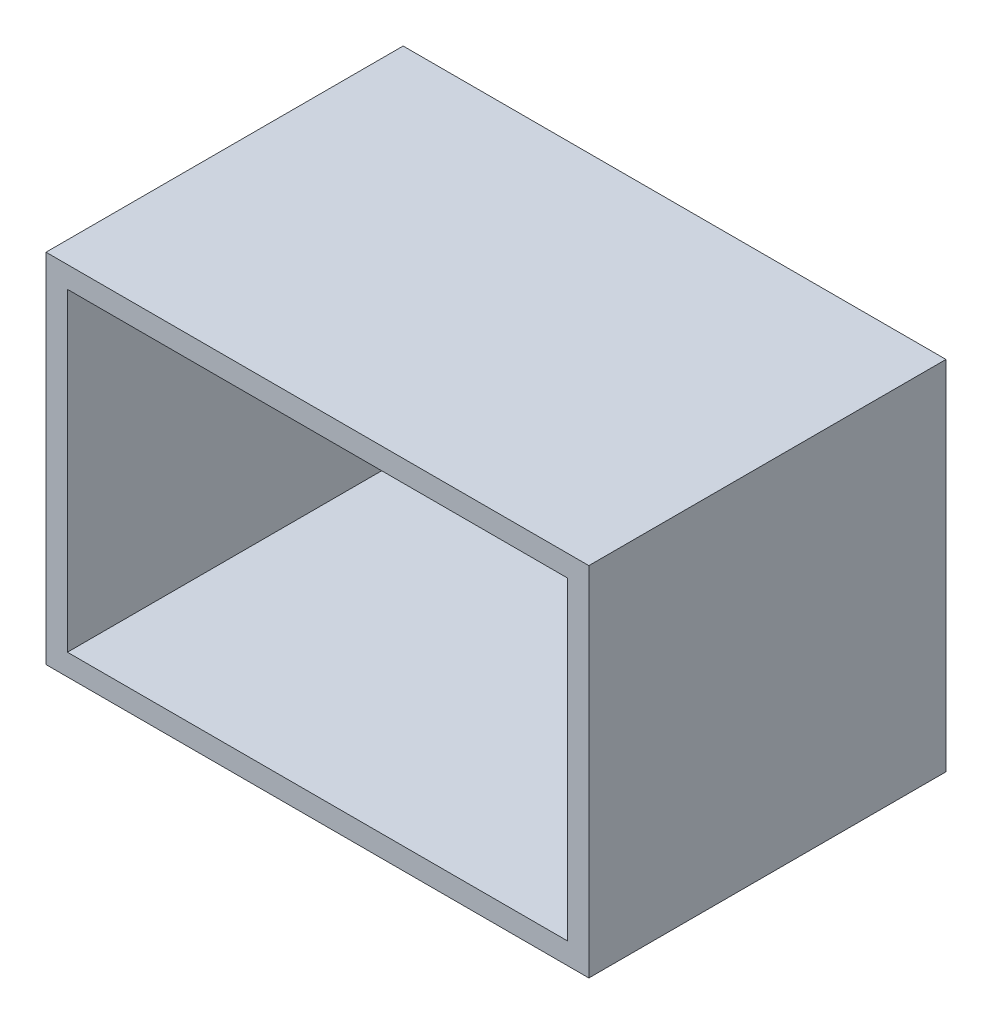
ISO-10303-21;
HEADER;
FILE_DESCRIPTION(('STEP AP214'),'2;1');
FILE_NAME('part.step','',(''),(''),'','','');
FILE_SCHEMA(('AUTOMOTIVE_DESIGN { 1 0 10303 214 1 1 1 1 }'));
ENDSEC;
DATA;
#1=APPLICATION_CONTEXT('core data for automotive mechanical design processes');
#2=APPLICATION_PROTOCOL_DEFINITION('international standard','automotive_design',2000,#1);
#3=PRODUCT_CONTEXT('',#1,'mechanical');
#4=PRODUCT('Part','Part','',(#3));
#5=PRODUCT_RELATED_PRODUCT_CATEGORY('part','',(#4));
#6=PRODUCT_DEFINITION_FORMATION('','',#4);
#7=PRODUCT_DEFINITION_CONTEXT('part definition',#1,'design');
#8=PRODUCT_DEFINITION('design','',#6,#7);
#9=PRODUCT_DEFINITION_SHAPE('','',#8);
#10=(LENGTH_UNIT() NAMED_UNIT(*) SI_UNIT(.MILLI.,.METRE.));
#11=(NAMED_UNIT(*) PLANE_ANGLE_UNIT() SI_UNIT($,.RADIAN.));
#12=(NAMED_UNIT(*) SI_UNIT($,.STERADIAN.) SOLID_ANGLE_UNIT());
#13=UNCERTAINTY_MEASURE_WITH_UNIT(LENGTH_MEASURE(1.E-05),#10,'distance_accuracy_value','');
#14=(GEOMETRIC_REPRESENTATION_CONTEXT(3) GLOBAL_UNCERTAINTY_ASSIGNED_CONTEXT((#13)) GLOBAL_UNIT_ASSIGNED_CONTEXT((#10,
#11,#12)) REPRESENTATION_CONTEXT('',''));
#15=CARTESIAN_POINT('',(0.,0.,0.));
#16=DIRECTION('',(0.,0.,1.));
#17=DIRECTION('',(1.,0.,0.));
#18=AXIS2_PLACEMENT_3D('',#15,#16,#17);
#19=CARTESIAN_POINT('',(0.,0.,50.));
#20=DIRECTION('',(0.,0.,-1.));
#21=DIRECTION('',(-1.,0.,0.));
#22=AXIS2_PLACEMENT_3D('',#19,#20,#21);
#23=PLANE('',#22);
#24=DIRECTION('',(0.,1.,0.));
#25=VECTOR('',#24,1.);
#26=CARTESIAN_POINT('',(38.,-25.,50.));
#27=LINE('',#26,#25);
#28=CARTESIAN_POINT('',(38.,-25.,50.));
#29=VERTEX_POINT('',#28);
#30=CARTESIAN_POINT('',(38.,25.,50.));
#31=VERTEX_POINT('',#30);
#32=EDGE_CURVE('E142',#29,#31,#27,.T.);
#33=ORIENTED_EDGE('',*,*,#32,.T.);
#34=DIRECTION('',(-1.,0.,0.));
#35=VECTOR('',#34,1.);
#36=CARTESIAN_POINT('',(-38.,25.,50.));
#37=LINE('',#36,#35);
#38=CARTESIAN_POINT('',(-38.,25.,50.));
#39=VERTEX_POINT('',#38);
#40=EDGE_CURVE('E145',#31,#39,#37,.T.);
#41=ORIENTED_EDGE('',*,*,#40,.T.);
#42=DIRECTION('',(0.,-1.,0.));
#43=VECTOR('',#42,1.);
#44=CARTESIAN_POINT('',(-38.,-25.,50.));
#45=LINE('',#44,#43);
#46=CARTESIAN_POINT('',(-38.,-25.,50.));
#47=VERTEX_POINT('',#46);
#48=EDGE_CURVE('E148',#39,#47,#45,.T.);
#49=ORIENTED_EDGE('',*,*,#48,.T.);
#50=DIRECTION('',(1.,0.,0.));
#51=VECTOR('',#50,1.);
#52=CARTESIAN_POINT('',(-38.,-25.,50.));
#53=LINE('',#52,#51);
#54=EDGE_CURVE('E150',#47,#29,#53,.T.);
#55=ORIENTED_EDGE('',*,*,#54,.T.);
#56=EDGE_LOOP('',(#33,#41,#49,#55));
#57=FACE_BOUND('',#56,.T.);
#58=DIRECTION('',(0.,1.,0.));
#59=VECTOR('',#58,1.);
#60=CARTESIAN_POINT('',(35.,-22.,50.));
#61=LINE('',#60,#59);
#62=CARTESIAN_POINT('',(35.,-22.,50.));
#63=VERTEX_POINT('',#62);
#64=CARTESIAN_POINT('',(35.,22.,50.));
#65=VERTEX_POINT('',#64);
#66=EDGE_CURVE('E106',#63,#65,#61,.T.);
#67=ORIENTED_EDGE('',*,*,#66,.F.);
#68=DIRECTION('',(1.,0.,0.));
#69=VECTOR('',#68,1.);
#70=CARTESIAN_POINT('',(-35.,-22.,50.));
#71=LINE('',#70,#69);
#72=CARTESIAN_POINT('',(-35.,-22.,50.));
#73=VERTEX_POINT('',#72);
#74=EDGE_CURVE('E128',#73,#63,#71,.T.);
#75=ORIENTED_EDGE('',*,*,#74,.F.);
#76=DIRECTION('',(0.,-1.,0.));
#77=VECTOR('',#76,1.);
#78=CARTESIAN_POINT('',(-35.,-22.,50.));
#79=LINE('',#78,#77);
#80=CARTESIAN_POINT('',(-35.,22.,50.));
#81=VERTEX_POINT('',#80);
#82=EDGE_CURVE('E126',#81,#73,#79,.T.);
#83=ORIENTED_EDGE('',*,*,#82,.F.);
#84=DIRECTION('',(-1.,0.,0.));
#85=VECTOR('',#84,1.);
#86=CARTESIAN_POINT('',(-35.,22.,50.));
#87=LINE('',#86,#85);
#88=EDGE_CURVE('E114',#65,#81,#87,.T.);
#89=ORIENTED_EDGE('',*,*,#88,.F.);
#90=EDGE_LOOP('',(#67,#75,#83,#89));
#91=FACE_BOUND('',#90,.T.);
#92=ADVANCED_FACE('F41',(#57,#91),#23,.F.);
#93=CARTESIAN_POINT('',(0.,0.,0.));
#94=DIRECTION('',(0.,0.,-1.));
#95=DIRECTION('',(-1.,0.,0.));
#96=AXIS2_PLACEMENT_3D('',#93,#94,#95);
#97=PLANE('',#96);
#98=DIRECTION('',(0.,1.,0.));
#99=VECTOR('',#98,1.);
#100=CARTESIAN_POINT('',(38.,-25.,0.));
#101=LINE('',#100,#99);
#102=CARTESIAN_POINT('',(38.,-25.,0.));
#103=VERTEX_POINT('',#102);
#104=CARTESIAN_POINT('',(38.,25.,0.));
#105=VERTEX_POINT('',#104);
#106=EDGE_CURVE('E122',#103,#105,#101,.T.);
#107=ORIENTED_EDGE('',*,*,#106,.F.);
#108=DIRECTION('',(1.,0.,0.));
#109=VECTOR('',#108,1.);
#110=CARTESIAN_POINT('',(-38.,-25.,0.));
#111=LINE('',#110,#109);
#112=CARTESIAN_POINT('',(-38.,-25.,0.));
#113=VERTEX_POINT('',#112);
#114=EDGE_CURVE('E146',#113,#103,#111,.T.);
#115=ORIENTED_EDGE('',*,*,#114,.F.);
#116=DIRECTION('',(0.,-1.,0.));
#117=VECTOR('',#116,1.);
#118=CARTESIAN_POINT('',(-38.,-25.,0.));
#119=LINE('',#118,#117);
#120=CARTESIAN_POINT('',(-38.,25.,0.));
#121=VERTEX_POINT('',#120);
#122=EDGE_CURVE('E157',#121,#113,#119,.T.);
#123=ORIENTED_EDGE('',*,*,#122,.F.);
#124=DIRECTION('',(-1.,0.,0.));
#125=VECTOR('',#124,1.);
#126=CARTESIAN_POINT('',(-38.,25.,0.));
#127=LINE('',#126,#125);
#128=EDGE_CURVE('E155',#105,#121,#127,.T.);
#129=ORIENTED_EDGE('',*,*,#128,.F.);
#130=EDGE_LOOP('',(#107,#115,#123,#129));
#131=FACE_BOUND('',#130,.T.);
#132=DIRECTION('',(1.,0.,0.));
#133=VECTOR('',#132,1.);
#134=CARTESIAN_POINT('',(-35.,-22.,0.));
#135=LINE('',#134,#133);
#136=CARTESIAN_POINT('',(-35.,-22.,0.));
#137=VERTEX_POINT('',#136);
#138=CARTESIAN_POINT('',(35.,-22.,0.));
#139=VERTEX_POINT('',#138);
#140=EDGE_CURVE('E115',#137,#139,#135,.T.);
#141=ORIENTED_EDGE('',*,*,#140,.T.);
#142=DIRECTION('',(0.,1.,0.));
#143=VECTOR('',#142,1.);
#144=CARTESIAN_POINT('',(35.,-22.,0.));
#145=LINE('',#144,#143);
#146=CARTESIAN_POINT('',(35.,22.,0.));
#147=VERTEX_POINT('',#146);
#148=EDGE_CURVE('E64',#139,#147,#145,.T.);
#149=ORIENTED_EDGE('',*,*,#148,.T.);
#150=DIRECTION('',(-1.,0.,0.));
#151=VECTOR('',#150,1.);
#152=CARTESIAN_POINT('',(-35.,22.,0.));
#153=LINE('',#152,#151);
#154=CARTESIAN_POINT('',(-35.,22.,0.));
#155=VERTEX_POINT('',#154);
#156=EDGE_CURVE('E121',#147,#155,#153,.T.);
#157=ORIENTED_EDGE('',*,*,#156,.T.);
#158=DIRECTION('',(0.,-1.,0.));
#159=VECTOR('',#158,1.);
#160=CARTESIAN_POINT('',(-35.,-22.,0.));
#161=LINE('',#160,#159);
#162=EDGE_CURVE('E134',#155,#137,#161,.T.);
#163=ORIENTED_EDGE('',*,*,#162,.T.);
#164=EDGE_LOOP('',(#141,#149,#157,#163));
#165=FACE_BOUND('',#164,.T.);
#166=ADVANCED_FACE('F175',(#131,#165),#97,.T.);
#167=CARTESIAN_POINT('',(38.,-25.,50.));
#168=DIRECTION('',(-1.,0.,0.));
#169=DIRECTION('',(0.,0.,1.));
#170=AXIS2_PLACEMENT_3D('',#167,#168,#169);
#171=PLANE('',#170);
#172=ORIENTED_EDGE('',*,*,#106,.T.);
#173=DIRECTION('',(0.,0.,-1.));
#174=VECTOR('',#173,1.);
#175=CARTESIAN_POINT('',(38.,25.,50.));
#176=LINE('',#175,#174);
#177=EDGE_CURVE('E11',#31,#105,#176,.T.);
#178=ORIENTED_EDGE('',*,*,#177,.F.);
#179=ORIENTED_EDGE('',*,*,#32,.F.);
#180=DIRECTION('',(0.,0.,-1.));
#181=VECTOR('',#180,1.);
#182=CARTESIAN_POINT('',(38.,-25.,50.));
#183=LINE('',#182,#181);
#184=EDGE_CURVE('E152',#29,#103,#183,.T.);
#185=ORIENTED_EDGE('',*,*,#184,.T.);
#186=EDGE_LOOP('',(#172,#178,#179,#185));
#187=FACE_BOUND('',#186,.T.);
#188=ADVANCED_FACE('F43',(#187),#171,.F.);
#189=CARTESIAN_POINT('',(-38.,25.,50.));
#190=DIRECTION('',(0.,-1.,0.));
#191=DIRECTION('',(0.,0.,-1.));
#192=AXIS2_PLACEMENT_3D('',#189,#190,#191);
#193=PLANE('',#192);
#194=ORIENTED_EDGE('',*,*,#128,.T.);
#195=DIRECTION('',(0.,0.,-1.));
#196=VECTOR('',#195,1.);
#197=CARTESIAN_POINT('',(-38.,25.,50.));
#198=LINE('',#197,#196);
#199=EDGE_CURVE('E49',#39,#121,#198,.T.);
#200=ORIENTED_EDGE('',*,*,#199,.F.);
#201=ORIENTED_EDGE('',*,*,#40,.F.);
#202=ORIENTED_EDGE('',*,*,#177,.T.);
#203=EDGE_LOOP('',(#194,#200,#201,#202));
#204=FACE_BOUND('',#203,.T.);
#205=ADVANCED_FACE('F185',(#204),#193,.F.);
#206=CARTESIAN_POINT('',(-38.,-25.,50.));
#207=DIRECTION('',(1.,0.,0.));
#208=DIRECTION('',(0.,0.,-1.));
#209=AXIS2_PLACEMENT_3D('',#206,#207,#208);
#210=PLANE('',#209);
#211=ORIENTED_EDGE('',*,*,#122,.T.);
#212=DIRECTION('',(0.,0.,-1.));
#213=VECTOR('',#212,1.);
#214=CARTESIAN_POINT('',(-38.,-25.,50.));
#215=LINE('',#214,#213);
#216=EDGE_CURVE('E162',#47,#113,#215,.T.);
#217=ORIENTED_EDGE('',*,*,#216,.F.);
#218=ORIENTED_EDGE('',*,*,#48,.F.);
#219=ORIENTED_EDGE('',*,*,#199,.T.);
#220=EDGE_LOOP('',(#211,#217,#218,#219));
#221=FACE_BOUND('',#220,.T.);
#222=ADVANCED_FACE('F169',(#221),#210,.F.);
#223=CARTESIAN_POINT('',(-38.,-25.,50.));
#224=DIRECTION('',(0.,1.,0.));
#225=DIRECTION('',(0.,0.,1.));
#226=AXIS2_PLACEMENT_3D('',#223,#224,#225);
#227=PLANE('',#226);
#228=ORIENTED_EDGE('',*,*,#114,.T.);
#229=ORIENTED_EDGE('',*,*,#184,.F.);
#230=ORIENTED_EDGE('',*,*,#54,.F.);
#231=ORIENTED_EDGE('',*,*,#216,.T.);
#232=EDGE_LOOP('',(#228,#229,#230,#231));
#233=FACE_BOUND('',#232,.T.);
#234=ADVANCED_FACE('F179',(#233),#227,.F.);
#235=CARTESIAN_POINT('',(35.,-22.,50.));
#236=DIRECTION('',(-1.,0.,0.));
#237=DIRECTION('',(0.,0.,1.));
#238=AXIS2_PLACEMENT_3D('',#235,#236,#237);
#239=PLANE('',#238);
#240=ORIENTED_EDGE('',*,*,#148,.F.);
#241=DIRECTION('',(0.,0.,-1.));
#242=VECTOR('',#241,1.);
#243=CARTESIAN_POINT('',(35.,-22.,50.));
#244=LINE('',#243,#242);
#245=EDGE_CURVE('E110',#63,#139,#244,.T.);
#246=ORIENTED_EDGE('',*,*,#245,.F.);
#247=ORIENTED_EDGE('',*,*,#66,.T.);
#248=DIRECTION('',(0.,0.,-1.));
#249=VECTOR('',#248,1.);
#250=CARTESIAN_POINT('',(35.,22.,50.));
#251=LINE('',#250,#249);
#252=EDGE_CURVE('E109',#65,#147,#251,.T.);
#253=ORIENTED_EDGE('',*,*,#252,.T.);
#254=EDGE_LOOP('',(#240,#246,#247,#253));
#255=FACE_BOUND('',#254,.T.);
#256=ADVANCED_FACE('F108',(#255),#239,.T.);
#257=CARTESIAN_POINT('',(-35.,22.,50.));
#258=DIRECTION('',(0.,-1.,0.));
#259=DIRECTION('',(0.,0.,-1.));
#260=AXIS2_PLACEMENT_3D('',#257,#258,#259);
#261=PLANE('',#260);
#262=ORIENTED_EDGE('',*,*,#156,.F.);
#263=ORIENTED_EDGE('',*,*,#252,.F.);
#264=ORIENTED_EDGE('',*,*,#88,.T.);
#265=DIRECTION('',(0.,0.,-1.));
#266=VECTOR('',#265,1.);
#267=CARTESIAN_POINT('',(-35.,22.,50.));
#268=LINE('',#267,#266);
#269=EDGE_CURVE('E123',#81,#155,#268,.T.);
#270=ORIENTED_EDGE('',*,*,#269,.T.);
#271=EDGE_LOOP('',(#262,#263,#264,#270));
#272=FACE_BOUND('',#271,.T.);
#273=ADVANCED_FACE('F118',(#272),#261,.T.);
#274=CARTESIAN_POINT('',(-35.,-22.,50.));
#275=DIRECTION('',(1.,0.,0.));
#276=DIRECTION('',(0.,0.,-1.));
#277=AXIS2_PLACEMENT_3D('',#274,#275,#276);
#278=PLANE('',#277);
#279=ORIENTED_EDGE('',*,*,#162,.F.);
#280=ORIENTED_EDGE('',*,*,#269,.F.);
#281=ORIENTED_EDGE('',*,*,#82,.T.);
#282=DIRECTION('',(0.,0.,-1.));
#283=VECTOR('',#282,1.);
#284=CARTESIAN_POINT('',(-35.,-22.,50.));
#285=LINE('',#284,#283);
#286=EDGE_CURVE('E56',#73,#137,#285,.T.);
#287=ORIENTED_EDGE('',*,*,#286,.T.);
#288=EDGE_LOOP('',(#279,#280,#281,#287));
#289=FACE_BOUND('',#288,.T.);
#290=ADVANCED_FACE('F208',(#289),#278,.T.);
#291=CARTESIAN_POINT('',(-35.,-22.,50.));
#292=DIRECTION('',(0.,1.,0.));
#293=DIRECTION('',(0.,0.,1.));
#294=AXIS2_PLACEMENT_3D('',#291,#292,#293);
#295=PLANE('',#294);
#296=ORIENTED_EDGE('',*,*,#140,.F.);
#297=ORIENTED_EDGE('',*,*,#286,.F.);
#298=ORIENTED_EDGE('',*,*,#74,.T.);
#299=ORIENTED_EDGE('',*,*,#245,.T.);
#300=EDGE_LOOP('',(#296,#297,#298,#299));
#301=FACE_BOUND('',#300,.T.);
#302=ADVANCED_FACE('F212',(#301),#295,.T.);
#303=CLOSED_SHELL('',(#92,#166,#188,#205,#222,#234,#256,#273,#290,#302));
#304=MANIFOLD_SOLID_BREP('B2',#303);
#305=ADVANCED_BREP_SHAPE_REPRESENTATION('',(#18,#304),#14);
#306=SHAPE_DEFINITION_REPRESENTATION(#9,#305);
ENDSEC;
END-ISO-10303-21;
